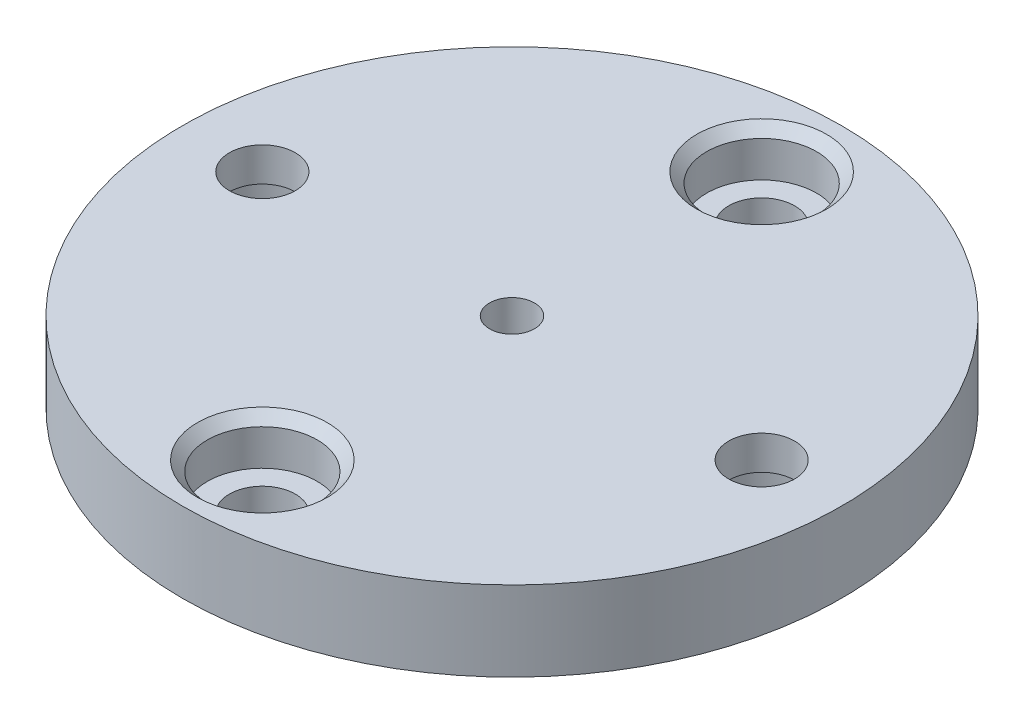
ISO-10303-21;
HEADER;
FILE_DESCRIPTION(('STEP AP214'),'2;1');
FILE_NAME('part.step','',(''),(''),'','','');
FILE_SCHEMA(('AUTOMOTIVE_DESIGN { 1 0 10303 214 1 1 1 1 }'));
ENDSEC;
DATA;
#1=APPLICATION_CONTEXT('core data for automotive mechanical design processes');
#2=APPLICATION_PROTOCOL_DEFINITION('international standard','automotive_design',2000,#1);
#3=PRODUCT_CONTEXT('',#1,'mechanical');
#4=PRODUCT('Part','Part','',(#3));
#5=PRODUCT_RELATED_PRODUCT_CATEGORY('part','',(#4));
#6=PRODUCT_DEFINITION_FORMATION('','',#4);
#7=PRODUCT_DEFINITION_CONTEXT('part definition',#1,'design');
#8=PRODUCT_DEFINITION('design','',#6,#7);
#9=PRODUCT_DEFINITION_SHAPE('','',#8);
#10=(LENGTH_UNIT() NAMED_UNIT(*) SI_UNIT(.MILLI.,.METRE.));
#11=(NAMED_UNIT(*) PLANE_ANGLE_UNIT() SI_UNIT($,.RADIAN.));
#12=(NAMED_UNIT(*) SI_UNIT($,.STERADIAN.) SOLID_ANGLE_UNIT());
#13=UNCERTAINTY_MEASURE_WITH_UNIT(LENGTH_MEASURE(1.E-05),#10,'distance_accuracy_value','');
#14=(GEOMETRIC_REPRESENTATION_CONTEXT(3) GLOBAL_UNCERTAINTY_ASSIGNED_CONTEXT((#13)) GLOBAL_UNIT_ASSIGNED_CONTEXT((#10,
#11,#12)) REPRESENTATION_CONTEXT('',''));
#15=CARTESIAN_POINT('',(0.,0.,0.));
#16=DIRECTION('',(0.,0.,1.));
#17=DIRECTION('',(1.,0.,0.));
#18=AXIS2_PLACEMENT_3D('',#15,#16,#17);
#19=CARTESIAN_POINT('',(0.,8.,0.));
#20=DIRECTION('',(0.,1.,0.));
#21=DIRECTION('',(0.,0.,1.));
#22=AXIS2_PLACEMENT_3D('',#19,#20,#21);
#23=PLANE('',#22);
#24=CARTESIAN_POINT('',(0.,8.,0.));
#25=DIRECTION('',(0.,1.,0.));
#26=DIRECTION('',(0.,0.,1.));
#27=AXIS2_PLACEMENT_3D('',#24,#25,#26);
#28=CIRCLE('',#27,33.);
#29=CARTESIAN_POINT('',(0.,8.,33.));
#30=VERTEX_POINT('',#29);
#31=EDGE_CURVE('E125',#30,#30,#28,.T.);
#32=ORIENTED_EDGE('',*,*,#31,.T.);
#33=EDGE_LOOP('',(#32));
#34=FACE_BOUND('',#33,.T.);
#35=CARTESIAN_POINT('',(25.,8.,0.));
#36=DIRECTION('',(0.,-1.,0.));
#37=DIRECTION('',(0.,0.,-1.));
#38=AXIS2_PLACEMENT_3D('',#35,#36,#37);
#39=CIRCLE('',#38,3.3);
#40=CARTESIAN_POINT('',(25.,8.,-3.3));
#41=VERTEX_POINT('',#40);
#42=EDGE_CURVE('E109',#41,#41,#39,.T.);
#43=ORIENTED_EDGE('',*,*,#42,.T.);
#44=EDGE_LOOP('',(#43));
#45=FACE_BOUND('',#44,.T.);
#46=CARTESIAN_POINT('',(-25.,8.,0.));
#47=DIRECTION('',(0.,-1.,0.));
#48=DIRECTION('',(0.,0.,-1.));
#49=AXIS2_PLACEMENT_3D('',#46,#47,#48);
#50=CIRCLE('',#49,3.3);
#51=CARTESIAN_POINT('',(-25.,8.,-3.3));
#52=VERTEX_POINT('',#51);
#53=EDGE_CURVE('E89',#52,#52,#50,.T.);
#54=ORIENTED_EDGE('',*,*,#53,.T.);
#55=EDGE_LOOP('',(#54));
#56=FACE_BOUND('',#55,.T.);
#57=CARTESIAN_POINT('',(0.,8.,25.));
#58=DIRECTION('',(0.,1.,0.));
#59=DIRECTION('',(0.,0.,1.));
#60=AXIS2_PLACEMENT_3D('',#57,#58,#59);
#61=CIRCLE('',#60,6.5);
#62=CARTESIAN_POINT('',(0.,8.,31.5));
#63=VERTEX_POINT('',#62);
#64=EDGE_CURVE('E269',#63,#63,#61,.T.);
#65=ORIENTED_EDGE('',*,*,#64,.F.);
#66=EDGE_LOOP('',(#65));
#67=FACE_BOUND('',#66,.T.);
#68=CARTESIAN_POINT('',(0.,8.,-25.));
#69=DIRECTION('',(0.,1.,0.));
#70=DIRECTION('',(0.,0.,1.));
#71=AXIS2_PLACEMENT_3D('',#68,#69,#70);
#72=CIRCLE('',#71,6.5);
#73=CARTESIAN_POINT('',(0.,8.,-18.5));
#74=VERTEX_POINT('',#73);
#75=EDGE_CURVE('E253',#74,#74,#72,.T.);
#76=ORIENTED_EDGE('',*,*,#75,.F.);
#77=EDGE_LOOP('',(#76));
#78=FACE_BOUND('',#77,.T.);
#79=CARTESIAN_POINT('',(0.,8.,0.));
#80=DIRECTION('',(0.,-1.,0.));
#81=DIRECTION('',(0.,0.,-1.));
#82=AXIS2_PLACEMENT_3D('',#79,#80,#81);
#83=CIRCLE('',#82,2.25);
#84=CARTESIAN_POINT('',(0.,8.,-2.25));
#85=VERTEX_POINT('',#84);
#86=EDGE_CURVE('E247',#85,#85,#83,.T.);
#87=ORIENTED_EDGE('',*,*,#86,.T.);
#88=EDGE_LOOP('',(#87));
#89=FACE_BOUND('',#88,.T.);
#90=ADVANCED_FACE('F37',(#34,#45,#56,#67,#78,#89),#23,.T.);
#91=CARTESIAN_POINT('',(0.,8.,0.));
#92=DIRECTION('',(0.,-1.,0.));
#93=DIRECTION('',(0.,0.,-1.));
#94=AXIS2_PLACEMENT_3D('',#91,#92,#93);
#95=CYLINDRICAL_SURFACE('',#94,33.);
#96=ORIENTED_EDGE('',*,*,#31,.F.);
#97=EDGE_LOOP('',(#96));
#98=FACE_BOUND('',#97,.T.);
#99=CARTESIAN_POINT('',(0.,0.,0.));
#100=DIRECTION('',(0.,1.,0.));
#101=DIRECTION('',(0.,0.,1.));
#102=AXIS2_PLACEMENT_3D('',#99,#100,#101);
#103=CIRCLE('',#102,33.);
#104=CARTESIAN_POINT('',(0.,0.,33.));
#105=VERTEX_POINT('',#104);
#106=EDGE_CURVE('E118',#105,#105,#103,.T.);
#107=ORIENTED_EDGE('',*,*,#106,.T.);
#108=EDGE_LOOP('',(#107));
#109=FACE_BOUND('',#108,.T.);
#110=ADVANCED_FACE('F132',(#98,#109),#95,.T.);
#111=CARTESIAN_POINT('',(0.,0.,0.));
#112=DIRECTION('',(0.,1.,0.));
#113=DIRECTION('',(0.,0.,1.));
#114=AXIS2_PLACEMENT_3D('',#111,#112,#113);
#115=PLANE('',#114);
#116=CARTESIAN_POINT('',(0.,0.,-25.));
#117=DIRECTION('',(0.,1.,0.));
#118=DIRECTION('',(0.,0.,1.));
#119=AXIS2_PLACEMENT_3D('',#116,#117,#118);
#120=CIRCLE('',#119,3.3);
#121=CARTESIAN_POINT('',(0.,0.,-21.7));
#122=VERTEX_POINT('',#121);
#123=EDGE_CURVE('E41',#122,#122,#120,.T.);
#124=ORIENTED_EDGE('',*,*,#123,.T.);
#125=EDGE_LOOP('',(#124));
#126=FACE_BOUND('',#125,.T.);
#127=CARTESIAN_POINT('',(0.,0.,25.));
#128=DIRECTION('',(0.,1.,0.));
#129=DIRECTION('',(0.,0.,1.));
#130=AXIS2_PLACEMENT_3D('',#127,#128,#129);
#131=CIRCLE('',#130,3.3);
#132=CARTESIAN_POINT('',(0.,0.,28.3));
#133=VERTEX_POINT('',#132);
#134=EDGE_CURVE('E55',#133,#133,#131,.T.);
#135=ORIENTED_EDGE('',*,*,#134,.T.);
#136=EDGE_LOOP('',(#135));
#137=FACE_BOUND('',#136,.T.);
#138=CARTESIAN_POINT('',(-25.,0.,0.));
#139=DIRECTION('',(0.,-1.,0.));
#140=DIRECTION('',(0.,0.,-1.));
#141=AXIS2_PLACEMENT_3D('',#138,#139,#140);
#142=CIRCLE('',#141,6.5);
#143=CARTESIAN_POINT('',(-25.,0.,-6.5));
#144=VERTEX_POINT('',#143);
#145=EDGE_CURVE('E58',#144,#144,#142,.T.);
#146=ORIENTED_EDGE('',*,*,#145,.F.);
#147=EDGE_LOOP('',(#146));
#148=FACE_BOUND('',#147,.T.);
#149=CARTESIAN_POINT('',(25.,0.,0.));
#150=DIRECTION('',(0.,-1.,0.));
#151=DIRECTION('',(0.,0.,-1.));
#152=AXIS2_PLACEMENT_3D('',#149,#150,#151);
#153=CIRCLE('',#152,6.5);
#154=CARTESIAN_POINT('',(25.,0.,-6.5));
#155=VERTEX_POINT('',#154);
#156=EDGE_CURVE('E93',#155,#155,#153,.T.);
#157=ORIENTED_EDGE('',*,*,#156,.F.);
#158=EDGE_LOOP('',(#157));
#159=FACE_BOUND('',#158,.T.);
#160=CARTESIAN_POINT('',(-17.6776695296637,0.,-17.6776695296637));
#161=DIRECTION('',(0.,-1.,0.));
#162=DIRECTION('',(0.,0.,-1.));
#163=AXIS2_PLACEMENT_3D('',#160,#161,#162);
#164=CIRCLE('',#163,3.05);
#165=CARTESIAN_POINT('',(-17.6776695296637,0.,-20.7276695296637));
#166=VERTEX_POINT('',#165);
#167=EDGE_CURVE('E113',#166,#166,#164,.T.);
#168=ORIENTED_EDGE('',*,*,#167,.F.);
#169=EDGE_LOOP('',(#168));
#170=FACE_BOUND('',#169,.T.);
#171=CARTESIAN_POINT('',(0.,0.,0.));
#172=DIRECTION('',(0.,-1.,0.));
#173=DIRECTION('',(0.,0.,-1.));
#174=AXIS2_PLACEMENT_3D('',#171,#172,#173);
#175=CIRCLE('',#174,15.5);
#176=CARTESIAN_POINT('',(0.,0.,-15.5));
#177=VERTEX_POINT('',#176);
#178=EDGE_CURVE('E52',#177,#177,#175,.T.);
#179=ORIENTED_EDGE('',*,*,#178,.F.);
#180=EDGE_LOOP('',(#179));
#181=FACE_BOUND('',#180,.T.);
#182=ORIENTED_EDGE('',*,*,#106,.F.);
#183=EDGE_LOOP('',(#182));
#184=FACE_BOUND('',#183,.T.);
#185=ADVANCED_FACE('F134',(#126,#137,#148,#159,#170,#181,#184),#115,.F.);
#186=CARTESIAN_POINT('',(0.,-3.,0.));
#187=DIRECTION('',(0.,1.,0.));
#188=DIRECTION('',(0.,0.,1.));
#189=AXIS2_PLACEMENT_3D('',#186,#187,#188);
#190=CYLINDRICAL_SURFACE('',#189,15.5);
#191=CARTESIAN_POINT('',(0.,-2.49999999999999,0.));
#192=DIRECTION('',(0.,-1.,0.));
#193=DIRECTION('',(0.,0.,-1.));
#194=AXIS2_PLACEMENT_3D('',#191,#192,#193);
#195=CIRCLE('',#194,15.5);
#196=CARTESIAN_POINT('',(0.,-2.49999999999999,-15.5));
#197=VERTEX_POINT('',#196);
#198=EDGE_CURVE('E10',#197,#197,#195,.F.);
#199=ORIENTED_EDGE('',*,*,#198,.T.);
#200=EDGE_LOOP('',(#199));
#201=FACE_BOUND('',#200,.T.);
#202=ORIENTED_EDGE('',*,*,#178,.T.);
#203=EDGE_LOOP('',(#202));
#204=FACE_BOUND('',#203,.T.);
#205=ADVANCED_FACE('F136',(#201,#204),#190,.T.);
#206=CARTESIAN_POINT('',(0.,-3.,0.));
#207=DIRECTION('',(0.,-1.,0.));
#208=DIRECTION('',(0.,0.,-1.));
#209=AXIS2_PLACEMENT_3D('',#206,#207,#208);
#210=PLANE('',#209);
#211=CARTESIAN_POINT('',(0.,-3.,0.));
#212=DIRECTION('',(0.,-1.,0.));
#213=DIRECTION('',(0.,0.,-1.));
#214=AXIS2_PLACEMENT_3D('',#211,#212,#213);
#215=CIRCLE('',#214,4.7);
#216=CARTESIAN_POINT('',(0.,-3.,-4.7));
#217=VERTEX_POINT('',#216);
#218=EDGE_CURVE('E243',#217,#217,#215,.T.);
#219=ORIENTED_EDGE('',*,*,#218,.F.);
#220=EDGE_LOOP('',(#219));
#221=FACE_BOUND('',#220,.T.);
#222=CARTESIAN_POINT('',(0.,-3.,0.));
#223=DIRECTION('',(0.,-1.,0.));
#224=DIRECTION('',(0.,0.,-1.));
#225=AXIS2_PLACEMENT_3D('',#222,#223,#224);
#226=CIRCLE('',#225,15.);
#227=CARTESIAN_POINT('',(0.,-3.,-15.));
#228=VERTEX_POINT('',#227);
#229=EDGE_CURVE('E46',#228,#228,#226,.T.);
#230=ORIENTED_EDGE('',*,*,#229,.T.);
#231=EDGE_LOOP('',(#230));
#232=FACE_BOUND('',#231,.T.);
#233=ADVANCED_FACE('F143',(#221,#232),#210,.T.);
#234=CARTESIAN_POINT('',(-17.6776695296637,5.,-17.6776695296637));
#235=DIRECTION('',(0.,-1.,0.));
#236=DIRECTION('',(0.,0.,-1.));
#237=AXIS2_PLACEMENT_3D('',#234,#235,#236);
#238=CYLINDRICAL_SURFACE('',#237,3.05);
#239=CARTESIAN_POINT('',(-17.6776695296637,5.,-17.6776695296637));
#240=DIRECTION('',(0.,-1.,0.));
#241=DIRECTION('',(0.,0.,-1.));
#242=AXIS2_PLACEMENT_3D('',#239,#240,#241);
#243=CIRCLE('',#242,3.05);
#244=CARTESIAN_POINT('',(-17.6776695296637,5.,-20.7276695296637));
#245=VERTEX_POINT('',#244);
#246=EDGE_CURVE('E114',#245,#245,#243,.T.);
#247=ORIENTED_EDGE('',*,*,#246,.F.);
#248=EDGE_LOOP('',(#247));
#249=FACE_BOUND('',#248,.T.);
#250=ORIENTED_EDGE('',*,*,#167,.T.);
#251=EDGE_LOOP('',(#250));
#252=FACE_BOUND('',#251,.T.);
#253=ADVANCED_FACE('F156',(#249,#252),#238,.F.);
#254=CARTESIAN_POINT('',(-17.6776695296637,5.,-17.6776695296637));
#255=DIRECTION('',(0.,-1.,0.));
#256=DIRECTION('',(0.,0.,-1.));
#257=AXIS2_PLACEMENT_3D('',#254,#255,#256);
#258=PLANE('',#257);
#259=ORIENTED_EDGE('',*,*,#246,.T.);
#260=EDGE_LOOP('',(#259));
#261=FACE_BOUND('',#260,.T.);
#262=ADVANCED_FACE('F160',(#261),#258,.T.);
#263=CARTESIAN_POINT('',(0.,-3.,0.));
#264=DIRECTION('',(0.,1.,0.));
#265=DIRECTION('',(0.,0.,1.));
#266=AXIS2_PLACEMENT_3D('',#263,#264,#265);
#267=CONICAL_SURFACE('',#266,15.,0.785398163397464);
#268=ORIENTED_EDGE('',*,*,#198,.F.);
#269=EDGE_LOOP('',(#268));
#270=FACE_BOUND('',#269,.T.);
#271=ORIENTED_EDGE('',*,*,#229,.F.);
#272=EDGE_LOOP('',(#271));
#273=FACE_BOUND('',#272,.T.);
#274=ADVANCED_FACE('F39',(#270,#273),#267,.T.);
#275=CARTESIAN_POINT('',(25.,0.,0.));
#276=DIRECTION('',(0.,-1.,0.));
#277=DIRECTION('',(0.,0.,-1.));
#278=AXIS2_PLACEMENT_3D('',#275,#276,#277);
#279=CYLINDRICAL_SURFACE('',#278,3.3);
#280=ORIENTED_EDGE('',*,*,#42,.F.);
#281=EDGE_LOOP('',(#280));
#282=FACE_BOUND('',#281,.T.);
#283=CARTESIAN_POINT('',(25.,4.59999999999999,0.));
#284=DIRECTION('',(0.,-1.,0.));
#285=DIRECTION('',(0.,0.,-1.));
#286=AXIS2_PLACEMENT_3D('',#283,#284,#285);
#287=CIRCLE('',#286,3.30000000000001);
#288=CARTESIAN_POINT('',(25.,4.59999999999999,-3.30000000000001));
#289=VERTEX_POINT('',#288);
#290=EDGE_CURVE('E105',#289,#289,#287,.T.);
#291=ORIENTED_EDGE('',*,*,#290,.T.);
#292=EDGE_LOOP('',(#291));
#293=FACE_BOUND('',#292,.T.);
#294=ADVANCED_FACE('F165',(#282,#293),#279,.F.);
#295=CARTESIAN_POINT('',(30.5,4.59999999999999,0.));
#296=DIRECTION('',(0.,1.,0.));
#297=DIRECTION('',(0.,0.,1.));
#298=AXIS2_PLACEMENT_3D('',#295,#296,#297);
#299=PLANE('',#298);
#300=ORIENTED_EDGE('',*,*,#290,.F.);
#301=EDGE_LOOP('',(#300));
#302=FACE_BOUND('',#301,.T.);
#303=CARTESIAN_POINT('',(25.,4.59999999999999,0.));
#304=DIRECTION('',(0.,-1.,0.));
#305=DIRECTION('',(0.,0.,-1.));
#306=AXIS2_PLACEMENT_3D('',#303,#304,#305);
#307=CIRCLE('',#306,5.49999999999999);
#308=CARTESIAN_POINT('',(25.,4.59999999999999,-5.49999999999999));
#309=VERTEX_POINT('',#308);
#310=EDGE_CURVE('E101',#309,#309,#307,.T.);
#311=ORIENTED_EDGE('',*,*,#310,.T.);
#312=EDGE_LOOP('',(#311));
#313=FACE_BOUND('',#312,.T.);
#314=ADVANCED_FACE('F168',(#302,#313),#299,.F.);
#315=CARTESIAN_POINT('',(25.,0.,0.));
#316=DIRECTION('',(0.,-1.,0.));
#317=DIRECTION('',(0.,0.,-1.));
#318=AXIS2_PLACEMENT_3D('',#315,#316,#317);
#319=CYLINDRICAL_SURFACE('',#318,5.49999999999999);
#320=ORIENTED_EDGE('',*,*,#310,.F.);
#321=EDGE_LOOP('',(#320));
#322=FACE_BOUND('',#321,.T.);
#323=CARTESIAN_POINT('',(25.,1.,0.));
#324=DIRECTION('',(0.,-1.,0.));
#325=DIRECTION('',(0.,0.,-1.));
#326=AXIS2_PLACEMENT_3D('',#323,#324,#325);
#327=CIRCLE('',#326,5.49999999999999);
#328=CARTESIAN_POINT('',(25.,1.,-5.49999999999999));
#329=VERTEX_POINT('',#328);
#330=EDGE_CURVE('E97',#329,#329,#327,.T.);
#331=ORIENTED_EDGE('',*,*,#330,.T.);
#332=EDGE_LOOP('',(#331));
#333=FACE_BOUND('',#332,.T.);
#334=ADVANCED_FACE('F172',(#322,#333),#319,.F.);
#335=CARTESIAN_POINT('',(25.,0.,0.));
#336=DIRECTION('',(0.,-1.,0.));
#337=DIRECTION('',(0.,0.,-1.));
#338=AXIS2_PLACEMENT_3D('',#335,#336,#337);
#339=CONICAL_SURFACE('',#338,6.5,0.785398163397447);
#340=ORIENTED_EDGE('',*,*,#330,.F.);
#341=EDGE_LOOP('',(#340));
#342=FACE_BOUND('',#341,.T.);
#343=ORIENTED_EDGE('',*,*,#156,.T.);
#344=EDGE_LOOP('',(#343));
#345=FACE_BOUND('',#344,.T.);
#346=ADVANCED_FACE('F176',(#342,#345),#339,.F.);
#347=CARTESIAN_POINT('',(-25.,0.,0.));
#348=DIRECTION('',(0.,-1.,0.));
#349=DIRECTION('',(0.,0.,-1.));
#350=AXIS2_PLACEMENT_3D('',#347,#348,#349);
#351=CYLINDRICAL_SURFACE('',#350,3.3);
#352=ORIENTED_EDGE('',*,*,#53,.F.);
#353=EDGE_LOOP('',(#352));
#354=FACE_BOUND('',#353,.T.);
#355=CARTESIAN_POINT('',(-25.,4.59999999999999,0.));
#356=DIRECTION('',(0.,-1.,0.));
#357=DIRECTION('',(0.,0.,-1.));
#358=AXIS2_PLACEMENT_3D('',#355,#356,#357);
#359=CIRCLE('',#358,3.30000000000001);
#360=CARTESIAN_POINT('',(-25.,4.59999999999999,-3.30000000000001));
#361=VERTEX_POINT('',#360);
#362=EDGE_CURVE('E85',#361,#361,#359,.T.);
#363=ORIENTED_EDGE('',*,*,#362,.T.);
#364=EDGE_LOOP('',(#363));
#365=FACE_BOUND('',#364,.T.);
#366=ADVANCED_FACE('F180',(#354,#365),#351,.F.);
#367=CARTESIAN_POINT('',(-19.5,4.59999999999999,0.));
#368=DIRECTION('',(0.,1.,0.));
#369=DIRECTION('',(0.,0.,1.));
#370=AXIS2_PLACEMENT_3D('',#367,#368,#369);
#371=PLANE('',#370);
#372=ORIENTED_EDGE('',*,*,#362,.F.);
#373=EDGE_LOOP('',(#372));
#374=FACE_BOUND('',#373,.T.);
#375=CARTESIAN_POINT('',(-25.,4.59999999999999,0.));
#376=DIRECTION('',(0.,-1.,0.));
#377=DIRECTION('',(0.,0.,-1.));
#378=AXIS2_PLACEMENT_3D('',#375,#376,#377);
#379=CIRCLE('',#378,5.49999999999999);
#380=CARTESIAN_POINT('',(-25.,4.59999999999999,-5.49999999999999));
#381=VERTEX_POINT('',#380);
#382=EDGE_CURVE('E81',#381,#381,#379,.T.);
#383=ORIENTED_EDGE('',*,*,#382,.T.);
#384=EDGE_LOOP('',(#383));
#385=FACE_BOUND('',#384,.T.);
#386=ADVANCED_FACE('F184',(#374,#385),#371,.F.);
#387=CARTESIAN_POINT('',(-25.,0.,0.));
#388=DIRECTION('',(0.,-1.,0.));
#389=DIRECTION('',(0.,0.,-1.));
#390=AXIS2_PLACEMENT_3D('',#387,#388,#389);
#391=CYLINDRICAL_SURFACE('',#390,5.49999999999999);
#392=ORIENTED_EDGE('',*,*,#382,.F.);
#393=EDGE_LOOP('',(#392));
#394=FACE_BOUND('',#393,.T.);
#395=CARTESIAN_POINT('',(-25.,1.,0.));
#396=DIRECTION('',(0.,-1.,0.));
#397=DIRECTION('',(0.,0.,-1.));
#398=AXIS2_PLACEMENT_3D('',#395,#396,#397);
#399=CIRCLE('',#398,5.49999999999999);
#400=CARTESIAN_POINT('',(-25.,1.,-5.49999999999999));
#401=VERTEX_POINT('',#400);
#402=EDGE_CURVE('E65',#401,#401,#399,.T.);
#403=ORIENTED_EDGE('',*,*,#402,.T.);
#404=EDGE_LOOP('',(#403));
#405=FACE_BOUND('',#404,.T.);
#406=ADVANCED_FACE('F188',(#394,#405),#391,.F.);
#407=CARTESIAN_POINT('',(-25.,0.,0.));
#408=DIRECTION('',(0.,-1.,0.));
#409=DIRECTION('',(0.,0.,-1.));
#410=AXIS2_PLACEMENT_3D('',#407,#408,#409);
#411=CONICAL_SURFACE('',#410,6.5,0.785398163397447);
#412=ORIENTED_EDGE('',*,*,#402,.F.);
#413=EDGE_LOOP('',(#412));
#414=FACE_BOUND('',#413,.T.);
#415=ORIENTED_EDGE('',*,*,#145,.T.);
#416=EDGE_LOOP('',(#415));
#417=FACE_BOUND('',#416,.T.);
#418=ADVANCED_FACE('F192',(#414,#417),#411,.F.);
#419=CARTESIAN_POINT('',(0.,8.,25.));
#420=DIRECTION('',(0.,1.,0.));
#421=DIRECTION('',(0.,0.,1.));
#422=AXIS2_PLACEMENT_3D('',#419,#420,#421);
#423=CYLINDRICAL_SURFACE('',#422,3.3);
#424=CARTESIAN_POINT('',(0.,3.40000000000001,25.));
#425=DIRECTION('',(0.,1.,0.));
#426=DIRECTION('',(0.,0.,1.));
#427=AXIS2_PLACEMENT_3D('',#424,#425,#426);
#428=CIRCLE('',#427,3.30000000000001);
#429=CARTESIAN_POINT('',(0.,3.40000000000001,28.3));
#430=VERTEX_POINT('',#429);
#431=EDGE_CURVE('E59',#430,#430,#428,.T.);
#432=ORIENTED_EDGE('',*,*,#431,.T.);
#433=EDGE_LOOP('',(#432));
#434=FACE_BOUND('',#433,.T.);
#435=ORIENTED_EDGE('',*,*,#134,.F.);
#436=EDGE_LOOP('',(#435));
#437=FACE_BOUND('',#436,.T.);
#438=ADVANCED_FACE('F196',(#434,#437),#423,.F.);
#439=CARTESIAN_POINT('',(5.49999999999999,3.40000000000001,25.));
#440=DIRECTION('',(0.,-1.,0.));
#441=DIRECTION('',(0.,0.,-1.));
#442=AXIS2_PLACEMENT_3D('',#439,#440,#441);
#443=PLANE('',#442);
#444=ORIENTED_EDGE('',*,*,#431,.F.);
#445=EDGE_LOOP('',(#444));
#446=FACE_BOUND('',#445,.T.);
#447=CARTESIAN_POINT('',(0.,3.40000000000001,25.));
#448=DIRECTION('',(0.,1.,0.));
#449=DIRECTION('',(0.,0.,1.));
#450=AXIS2_PLACEMENT_3D('',#447,#448,#449);
#451=CIRCLE('',#450,5.49999999999999);
#452=CARTESIAN_POINT('',(0.,3.40000000000001,30.5));
#453=VERTEX_POINT('',#452);
#454=EDGE_CURVE('E68',#453,#453,#451,.T.);
#455=ORIENTED_EDGE('',*,*,#454,.T.);
#456=EDGE_LOOP('',(#455));
#457=FACE_BOUND('',#456,.T.);
#458=ADVANCED_FACE('F200',(#446,#457),#443,.F.);
#459=CARTESIAN_POINT('',(0.,8.,25.));
#460=DIRECTION('',(0.,1.,0.));
#461=DIRECTION('',(0.,0.,1.));
#462=AXIS2_PLACEMENT_3D('',#459,#460,#461);
#463=CYLINDRICAL_SURFACE('',#462,5.49999999999999);
#464=ORIENTED_EDGE('',*,*,#454,.F.);
#465=EDGE_LOOP('',(#464));
#466=FACE_BOUND('',#465,.T.);
#467=CARTESIAN_POINT('',(0.,7.,25.));
#468=DIRECTION('',(0.,1.,0.));
#469=DIRECTION('',(0.,0.,1.));
#470=AXIS2_PLACEMENT_3D('',#467,#468,#469);
#471=CIRCLE('',#470,5.49999999999999);
#472=CARTESIAN_POINT('',(0.,7.,30.5));
#473=VERTEX_POINT('',#472);
#474=EDGE_CURVE('E74',#473,#473,#471,.T.);
#475=ORIENTED_EDGE('',*,*,#474,.T.);
#476=EDGE_LOOP('',(#475));
#477=FACE_BOUND('',#476,.T.);
#478=ADVANCED_FACE('F203',(#466,#477),#463,.F.);
#479=CARTESIAN_POINT('',(0.,8.,25.));
#480=DIRECTION('',(0.,1.,0.));
#481=DIRECTION('',(0.,0.,1.));
#482=AXIS2_PLACEMENT_3D('',#479,#480,#481);
#483=CONICAL_SURFACE('',#482,6.5,0.785398163397447);
#484=ORIENTED_EDGE('',*,*,#474,.F.);
#485=EDGE_LOOP('',(#484));
#486=FACE_BOUND('',#485,.T.);
#487=ORIENTED_EDGE('',*,*,#64,.T.);
#488=EDGE_LOOP('',(#487));
#489=FACE_BOUND('',#488,.T.);
#490=ADVANCED_FACE('F207',(#486,#489),#483,.F.);
#491=CARTESIAN_POINT('',(0.,8.,-25.));
#492=DIRECTION('',(0.,1.,0.));
#493=DIRECTION('',(0.,0.,1.));
#494=AXIS2_PLACEMENT_3D('',#491,#492,#493);
#495=CYLINDRICAL_SURFACE('',#494,3.3);
#496=CARTESIAN_POINT('',(0.,3.40000000000001,-25.));
#497=DIRECTION('',(0.,1.,0.));
#498=DIRECTION('',(0.,0.,1.));
#499=AXIS2_PLACEMENT_3D('',#496,#497,#498);
#500=CIRCLE('',#499,3.30000000000001);
#501=CARTESIAN_POINT('',(0.,3.40000000000001,-21.7));
#502=VERTEX_POINT('',#501);
#503=EDGE_CURVE('E265',#502,#502,#500,.T.);
#504=ORIENTED_EDGE('',*,*,#503,.T.);
#505=EDGE_LOOP('',(#504));
#506=FACE_BOUND('',#505,.T.);
#507=ORIENTED_EDGE('',*,*,#123,.F.);
#508=EDGE_LOOP('',(#507));
#509=FACE_BOUND('',#508,.T.);
#510=ADVANCED_FACE('F211',(#506,#509),#495,.F.);
#511=CARTESIAN_POINT('',(5.49999999999999,3.40000000000001,-25.));
#512=DIRECTION('',(0.,-1.,0.));
#513=DIRECTION('',(0.,0.,-1.));
#514=AXIS2_PLACEMENT_3D('',#511,#512,#513);
#515=PLANE('',#514);
#516=ORIENTED_EDGE('',*,*,#503,.F.);
#517=EDGE_LOOP('',(#516));
#518=FACE_BOUND('',#517,.T.);
#519=CARTESIAN_POINT('',(0.,3.40000000000001,-25.));
#520=DIRECTION('',(0.,1.,0.));
#521=DIRECTION('',(0.,0.,1.));
#522=AXIS2_PLACEMENT_3D('',#519,#520,#521);
#523=CIRCLE('',#522,5.49999999999999);
#524=CARTESIAN_POINT('',(0.,3.40000000000001,-19.5));
#525=VERTEX_POINT('',#524);
#526=EDGE_CURVE('E261',#525,#525,#523,.T.);
#527=ORIENTED_EDGE('',*,*,#526,.T.);
#528=EDGE_LOOP('',(#527));
#529=FACE_BOUND('',#528,.T.);
#530=ADVANCED_FACE('F215',(#518,#529),#515,.F.);
#531=CARTESIAN_POINT('',(0.,8.,-25.));
#532=DIRECTION('',(0.,1.,0.));
#533=DIRECTION('',(0.,0.,1.));
#534=AXIS2_PLACEMENT_3D('',#531,#532,#533);
#535=CYLINDRICAL_SURFACE('',#534,5.49999999999999);
#536=ORIENTED_EDGE('',*,*,#526,.F.);
#537=EDGE_LOOP('',(#536));
#538=FACE_BOUND('',#537,.T.);
#539=CARTESIAN_POINT('',(0.,7.,-25.));
#540=DIRECTION('',(0.,1.,0.));
#541=DIRECTION('',(0.,0.,1.));
#542=AXIS2_PLACEMENT_3D('',#539,#540,#541);
#543=CIRCLE('',#542,5.49999999999999);
#544=CARTESIAN_POINT('',(0.,7.,-19.5));
#545=VERTEX_POINT('',#544);
#546=EDGE_CURVE('E257',#545,#545,#543,.T.);
#547=ORIENTED_EDGE('',*,*,#546,.T.);
#548=EDGE_LOOP('',(#547));
#549=FACE_BOUND('',#548,.T.);
#550=ADVANCED_FACE('F219',(#538,#549),#535,.F.);
#551=CARTESIAN_POINT('',(0.,8.,-25.));
#552=DIRECTION('',(0.,1.,0.));
#553=DIRECTION('',(0.,0.,1.));
#554=AXIS2_PLACEMENT_3D('',#551,#552,#553);
#555=CONICAL_SURFACE('',#554,6.5,0.785398163397447);
#556=ORIENTED_EDGE('',*,*,#546,.F.);
#557=EDGE_LOOP('',(#556));
#558=FACE_BOUND('',#557,.T.);
#559=ORIENTED_EDGE('',*,*,#75,.T.);
#560=EDGE_LOOP('',(#559));
#561=FACE_BOUND('',#560,.T.);
#562=ADVANCED_FACE('F223',(#558,#561),#555,.F.);
#563=CARTESIAN_POINT('',(0.,-3.,0.));
#564=DIRECTION('',(0.,-1.,0.));
#565=DIRECTION('',(0.,0.,-1.));
#566=AXIS2_PLACEMENT_3D('',#563,#564,#565);
#567=CYLINDRICAL_SURFACE('',#566,2.25);
#568=ORIENTED_EDGE('',*,*,#86,.F.);
#569=EDGE_LOOP('',(#568));
#570=FACE_BOUND('',#569,.T.);
#571=CARTESIAN_POINT('',(0.,-0.550000000000001,0.));
#572=DIRECTION('',(0.,-1.,0.));
#573=DIRECTION('',(0.,0.,-1.));
#574=AXIS2_PLACEMENT_3D('',#571,#572,#573);
#575=CIRCLE('',#574,2.25);
#576=CARTESIAN_POINT('',(0.,-0.550000000000001,-2.25));
#577=VERTEX_POINT('',#576);
#578=EDGE_CURVE('E240',#577,#577,#575,.T.);
#579=ORIENTED_EDGE('',*,*,#578,.T.);
#580=EDGE_LOOP('',(#579));
#581=FACE_BOUND('',#580,.T.);
#582=ADVANCED_FACE('F227',(#570,#581),#567,.F.);
#583=CARTESIAN_POINT('',(0.,-3.,0.));
#584=DIRECTION('',(0.,-1.,0.));
#585=DIRECTION('',(0.,0.,-1.));
#586=AXIS2_PLACEMENT_3D('',#583,#584,#585);
#587=CONICAL_SURFACE('',#586,4.7,0.785398163397449);
#588=ORIENTED_EDGE('',*,*,#578,.F.);
#589=EDGE_LOOP('',(#588));
#590=FACE_BOUND('',#589,.T.);
#591=ORIENTED_EDGE('',*,*,#218,.T.);
#592=EDGE_LOOP('',(#591));
#593=FACE_BOUND('',#592,.T.);
#594=ADVANCED_FACE('F231',(#590,#593),#587,.F.);
#595=CLOSED_SHELL('',(#90,#110,#185,#205,#233,#253,#262,#274,#294,#314,#334,#346,#366,#386,#406,
#418,#438,#458,#478,#490,#510,#530,#550,#562,#582,#594));
#596=MANIFOLD_SOLID_BREP('B2',#595);
#597=ADVANCED_BREP_SHAPE_REPRESENTATION('',(#18,#596),#14);
#598=SHAPE_DEFINITION_REPRESENTATION(#9,#597);
ENDSEC;
END-ISO-10303-21;
